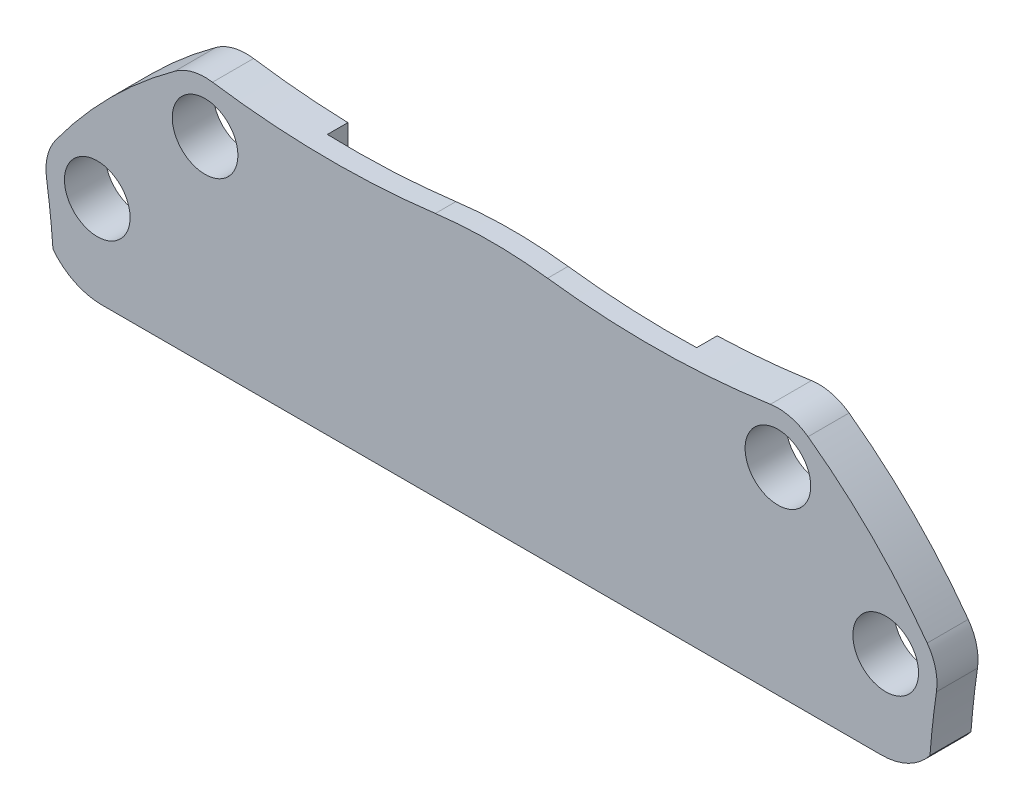
ISO-10303-21;
HEADER;
FILE_DESCRIPTION(('STEP AP214'),'2;1');
FILE_NAME('part.step','',(''),(''),'','','');
FILE_SCHEMA(('AUTOMOTIVE_DESIGN { 1 0 10303 214 1 1 1 1 }'));
ENDSEC;
DATA;
#1=APPLICATION_CONTEXT('core data for automotive mechanical design processes');
#2=APPLICATION_PROTOCOL_DEFINITION('international standard','automotive_design',2000,#1);
#3=PRODUCT_CONTEXT('',#1,'mechanical');
#4=PRODUCT('Part','Part','',(#3));
#5=PRODUCT_RELATED_PRODUCT_CATEGORY('part','',(#4));
#6=PRODUCT_DEFINITION_FORMATION('','',#4);
#7=PRODUCT_DEFINITION_CONTEXT('part definition',#1,'design');
#8=PRODUCT_DEFINITION('design','',#6,#7);
#9=PRODUCT_DEFINITION_SHAPE('','',#8);
#10=(LENGTH_UNIT() NAMED_UNIT(*) SI_UNIT(.MILLI.,.METRE.));
#11=(NAMED_UNIT(*) PLANE_ANGLE_UNIT() SI_UNIT($,.RADIAN.));
#12=(NAMED_UNIT(*) SI_UNIT($,.STERADIAN.) SOLID_ANGLE_UNIT());
#13=UNCERTAINTY_MEASURE_WITH_UNIT(LENGTH_MEASURE(1.E-05),#10,'distance_accuracy_value','');
#14=(GEOMETRIC_REPRESENTATION_CONTEXT(3) GLOBAL_UNCERTAINTY_ASSIGNED_CONTEXT((#13)) GLOBAL_UNIT_ASSIGNED_CONTEXT((#10,
#11,#12)) REPRESENTATION_CONTEXT('',''));
#15=CARTESIAN_POINT('',(0.,0.,0.));
#16=DIRECTION('',(0.,0.,1.));
#17=DIRECTION('',(1.,0.,0.));
#18=AXIS2_PLACEMENT_3D('',#15,#16,#17);
#19=CARTESIAN_POINT('',(0.,0.,2.));
#20=DIRECTION('',(0.,0.,1.));
#21=DIRECTION('',(1.,0.,0.));
#22=AXIS2_PLACEMENT_3D('',#19,#20,#21);
#23=PLANE('',#22);
#24=CARTESIAN_POINT('',(-19.2141536164048,13.9598997419465,2.));
#25=DIRECTION('',(0.,0.,1.));
#26=DIRECTION('',(1.,0.,0.));
#27=AXIS2_PLACEMENT_3D('',#24,#25,#26);
#28=CIRCLE('',#27,1.6);
#29=CARTESIAN_POINT('',(-17.6141536164048,13.9598997419465,2.));
#30=VERTEX_POINT('',#29);
#31=EDGE_CURVE('E111',#30,#30,#28,.F.);
#32=ORIENTED_EDGE('',*,*,#31,.T.);
#33=EDGE_LOOP('',(#32));
#34=FACE_BOUND('',#33,.T.);
#35=CARTESIAN_POINT('',(-13.9598997419461,19.2141536164051,2.));
#36=DIRECTION('',(0.,0.,1.));
#37=DIRECTION('',(1.,0.,0.));
#38=AXIS2_PLACEMENT_3D('',#35,#36,#37);
#39=CIRCLE('',#38,1.6);
#40=CARTESIAN_POINT('',(-12.3598997419461,19.2141536164051,2.));
#41=VERTEX_POINT('',#40);
#42=EDGE_CURVE('E223',#41,#41,#39,.F.);
#43=ORIENTED_EDGE('',*,*,#42,.T.);
#44=EDGE_LOOP('',(#43));
#45=FACE_BOUND('',#44,.T.);
#46=CARTESIAN_POINT('',(19.2141536164048,13.9598997419465,2.));
#47=DIRECTION('',(0.,0.,1.));
#48=DIRECTION('',(1.,0.,0.));
#49=AXIS2_PLACEMENT_3D('',#46,#47,#48);
#50=CIRCLE('',#49,1.6);
#51=CARTESIAN_POINT('',(20.8141536164048,13.9598997419465,2.));
#52=VERTEX_POINT('',#51);
#53=EDGE_CURVE('E219',#52,#52,#50,.T.);
#54=ORIENTED_EDGE('',*,*,#53,.F.);
#55=EDGE_LOOP('',(#54));
#56=FACE_BOUND('',#55,.T.);
#57=CARTESIAN_POINT('',(13.9598997419461,19.2141536164051,2.));
#58=DIRECTION('',(0.,0.,1.));
#59=DIRECTION('',(1.,0.,0.));
#60=AXIS2_PLACEMENT_3D('',#57,#58,#59);
#61=CIRCLE('',#60,1.6);
#62=CARTESIAN_POINT('',(15.5598997419461,19.2141536164051,2.));
#63=VERTEX_POINT('',#62);
#64=EDGE_CURVE('E141',#63,#63,#61,.T.);
#65=ORIENTED_EDGE('',*,*,#64,.F.);
#66=EDGE_LOOP('',(#65));
#67=FACE_BOUND('',#66,.T.);
#68=CARTESIAN_POINT('',(-61.2600208973505,7.763526238531,2.));
#69=DIRECTION('',(0.,0.,1.));
#70=DIRECTION('',(1.,0.,0.));
#71=AXIS2_PLACEMENT_3D('',#68,#69,#70);
#72=CIRCLE('',#71,40.0000000000088);
#73=CARTESIAN_POINT('',(-21.3716523307277,10.7498371891792,2.));
#74=VERTEX_POINT('',#73);
#75=CARTESIAN_POINT('',(-21.687439927048,13.5954071829217,2.));
#76=VERTEX_POINT('',#75);
#77=EDGE_CURVE('E357',#74,#76,#72,.T.);
#78=ORIENTED_EDGE('',*,*,#77,.F.);
#79=CARTESIAN_POINT('',(-19.,12.5870266791758,2.));
#80=DIRECTION('',(0.,0.,1.));
#81=DIRECTION('',(1.,0.,0.));
#82=AXIS2_PLACEMENT_3D('',#79,#80,#81);
#83=CIRCLE('',#82,3.);
#84=CARTESIAN_POINT('',(-19.,9.58702667917576,2.));
#85=VERTEX_POINT('',#84);
#86=EDGE_CURVE('E72',#74,#85,#83,.T.);
#87=ORIENTED_EDGE('',*,*,#86,.T.);
#88=DIRECTION('',(1.,0.,0.));
#89=VECTOR('',#88,1.);
#90=CARTESIAN_POINT('',(0.,9.58702667917577,2.));
#91=LINE('',#90,#89);
#92=CARTESIAN_POINT('',(19.,9.58702667917577,2.));
#93=VERTEX_POINT('',#92);
#94=EDGE_CURVE('E108',#85,#93,#91,.T.);
#95=ORIENTED_EDGE('',*,*,#94,.T.);
#96=CARTESIAN_POINT('',(19.,12.5870266791758,2.));
#97=DIRECTION('',(0.,0.,1.));
#98=DIRECTION('',(1.,0.,0.));
#99=AXIS2_PLACEMENT_3D('',#96,#97,#98);
#100=CIRCLE('',#99,3.);
#101=CARTESIAN_POINT('',(21.3716523307346,10.7498371891882,2.));
#102=VERTEX_POINT('',#101);
#103=EDGE_CURVE('E213',#93,#102,#100,.T.);
#104=ORIENTED_EDGE('',*,*,#103,.T.);
#105=CARTESIAN_POINT('',(61.2600208973574,7.76352623860516,2.));
#106=DIRECTION('',(0.,0.,1.));
#107=DIRECTION('',(1.,0.,0.));
#108=AXIS2_PLACEMENT_3D('',#105,#106,#107);
#109=CIRCLE('',#108,40.0000000000053);
#110=CARTESIAN_POINT('',(21.6874399270511,13.595407182947,2.));
#111=VERTEX_POINT('',#110);
#112=EDGE_CURVE('E348',#111,#102,#109,.T.);
#113=ORIENTED_EDGE('',*,*,#112,.F.);
#114=CARTESIAN_POINT('',(19.2141536164057,13.9598997419693,2.));
#115=DIRECTION('',(0.,0.,-1.));
#116=DIRECTION('',(1.,0.,0.));
#117=AXIS2_PLACEMENT_3D('',#114,#115,#116);
#118=CIRCLE('',#117,2.49999999999988);
#119=CARTESIAN_POINT('',(21.2366961023423,15.4293628727013,2.));
#120=VERTEX_POINT('',#119);
#121=EDGE_CURVE('E343',#120,#111,#118,.T.);
#122=ORIENTED_EDGE('',*,*,#121,.F.);
#123=CARTESIAN_POINT('',(8.54829072111014E-12,1.20749670708231E-11,2.));
#124=DIRECTION('',(0.,0.,-1.));
#125=DIRECTION('',(1.,0.,0.));
#126=AXIS2_PLACEMENT_3D('',#123,#124,#125);
#127=CIRCLE('',#126,26.2499999999994);
#128=CARTESIAN_POINT('',(15.4293628726751,21.236696102365,2.));
#129=VERTEX_POINT('',#128);
#130=EDGE_CURVE('E339',#129,#120,#127,.T.);
#131=ORIENTED_EDGE('',*,*,#130,.F.);
#132=CARTESIAN_POINT('',(13.95989974195,19.2141536164241,2.));
#133=DIRECTION('',(0.,0.,-1.));
#134=DIRECTION('',(1.,0.,0.));
#135=AXIS2_PLACEMENT_3D('',#132,#133,#134);
#136=CIRCLE('',#135,2.4999999999993);
#137=CARTESIAN_POINT('',(13.5954071829199,21.6874399270659,2.));
#138=VERTEX_POINT('',#137);
#139=EDGE_CURVE('E321',#138,#129,#136,.T.);
#140=ORIENTED_EDGE('',*,*,#139,.F.);
#141=CARTESIAN_POINT('',(7.76352623852903,61.2600208973597,2.));
#142=DIRECTION('',(0.,0.,1.));
#143=DIRECTION('',(1.,0.,0.));
#144=AXIS2_PLACEMENT_3D('',#141,#142,#143);
#145=CIRCLE('',#144,39.9999999999979);
#146=CARTESIAN_POINT('',(2.73452138766575,21.5774162674992,2.));
#147=VERTEX_POINT('',#146);
#148=EDGE_CURVE('E335',#147,#138,#145,.T.);
#149=ORIENTED_EDGE('',*,*,#148,.F.);
#150=CARTESIAN_POINT('',(8.54829072111014E-12,1.20749670708231E-11,2.));
#151=DIRECTION('',(0.,0.,-1.));
#152=DIRECTION('',(1.,0.,0.));
#153=AXIS2_PLACEMENT_3D('',#150,#151,#152);
#154=CIRCLE('',#153,21.7499999999988);
#155=CARTESIAN_POINT('',(-2.73452138767389,21.5774162674954,2.));
#156=VERTEX_POINT('',#155);
#157=EDGE_CURVE('E376',#156,#147,#154,.T.);
#158=ORIENTED_EDGE('',*,*,#157,.F.);
#159=CARTESIAN_POINT('',(-7.76352623858461,61.2600208973507,2.));
#160=DIRECTION('',(0.,0.,1.));
#161=DIRECTION('',(1.,0.,0.));
#162=AXIS2_PLACEMENT_3D('',#159,#160,#161);
#163=CIRCLE('',#162,39.9999999999993);
#164=CARTESIAN_POINT('',(-13.5954071829282,21.6874399270507,2.));
#165=VERTEX_POINT('',#164);
#166=EDGE_CURVE('E373',#165,#156,#163,.T.);
#167=ORIENTED_EDGE('',*,*,#166,.F.);
#168=CARTESIAN_POINT('',(-13.9598997419434,19.2141536164078,2.));
#169=DIRECTION('',(0.,0.,-1.));
#170=DIRECTION('',(1.,0.,0.));
#171=AXIS2_PLACEMENT_3D('',#168,#169,#170);
#172=CIRCLE('',#171,2.49999999999932);
#173=CARTESIAN_POINT('',(-15.4293628726804,21.2366961023401,2.));
#174=VERTEX_POINT('',#173);
#175=EDGE_CURVE('E369',#174,#165,#172,.T.);
#176=ORIENTED_EDGE('',*,*,#175,.F.);
#177=CARTESIAN_POINT('',(8.54829072111014E-12,1.20749670708231E-11,2.));
#178=DIRECTION('',(0.,0.,-1.));
#179=DIRECTION('',(1.,0.,0.));
#180=AXIS2_PLACEMENT_3D('',#177,#178,#179);
#181=CIRCLE('',#180,26.2499999999983);
#182=CARTESIAN_POINT('',(-21.2366961023416,15.429362872676,2.));
#183=VERTEX_POINT('',#182);
#184=EDGE_CURVE('E365',#183,#174,#181,.T.);
#185=ORIENTED_EDGE('',*,*,#184,.F.);
#186=CARTESIAN_POINT('',(-19.2141536164048,13.9598997419465,2.));
#187=DIRECTION('',(0.,0.,-1.));
#188=DIRECTION('',(1.,0.,0.));
#189=AXIS2_PLACEMENT_3D('',#186,#187,#188);
#190=CIRCLE('',#189,2.49999999999989);
#191=EDGE_CURVE('E361',#76,#183,#190,.T.);
#192=ORIENTED_EDGE('',*,*,#191,.F.);
#193=EDGE_LOOP('',(#78,#87,#95,#104,#113,#122,#131,#140,#149,#158,#167,#176,#185,#192));
#194=FACE_BOUND('',#193,.T.);
#195=ADVANCED_FACE('F47',(#34,#45,#56,#67,#194),#23,.T.);
#196=CARTESIAN_POINT('',(0.,0.,0.));
#197=DIRECTION('',(0.,0.,1.));
#198=DIRECTION('',(1.,0.,0.));
#199=AXIS2_PLACEMENT_3D('',#196,#197,#198);
#200=PLANE('',#199);
#201=CARTESIAN_POINT('',(13.9598997419461,19.2141536164051,0.));
#202=DIRECTION('',(0.,0.,1.));
#203=DIRECTION('',(1.,0.,0.));
#204=AXIS2_PLACEMENT_3D('',#201,#202,#203);
#205=CIRCLE('',#204,1.6);
#206=CARTESIAN_POINT('',(15.5598997419461,19.2141536164051,0.));
#207=VERTEX_POINT('',#206);
#208=EDGE_CURVE('E127',#207,#207,#205,.T.);
#209=ORIENTED_EDGE('',*,*,#208,.T.);
#210=EDGE_LOOP('',(#209));
#211=FACE_BOUND('',#210,.T.);
#212=CARTESIAN_POINT('',(19.2141536164048,13.9598997419465,0.));
#213=DIRECTION('',(0.,0.,1.));
#214=DIRECTION('',(1.,0.,0.));
#215=AXIS2_PLACEMENT_3D('',#212,#213,#214);
#216=CIRCLE('',#215,1.6);
#217=CARTESIAN_POINT('',(20.8141536164048,13.9598997419465,0.));
#218=VERTEX_POINT('',#217);
#219=EDGE_CURVE('E98',#218,#218,#216,.T.);
#220=ORIENTED_EDGE('',*,*,#219,.T.);
#221=EDGE_LOOP('',(#220));
#222=FACE_BOUND('',#221,.T.);
#223=DIRECTION('',(0.,-1.,0.));
#224=VECTOR('',#223,1.);
#225=CARTESIAN_POINT('',(9.,23.5870266791758,0.));
#226=LINE('',#225,#224);
#227=CARTESIAN_POINT('',(9.,21.2791363068829,0.));
#228=VERTEX_POINT('',#227);
#229=CARTESIAN_POINT('',(9.,9.58702667917577,0.));
#230=VERTEX_POINT('',#229);
#231=EDGE_CURVE('E202',#228,#230,#226,.T.);
#232=ORIENTED_EDGE('',*,*,#231,.F.);
#233=CARTESIAN_POINT('',(7.76352623852903,61.2600208973597,0.));
#234=DIRECTION('',(0.,0.,1.));
#235=DIRECTION('',(1.,0.,0.));
#236=AXIS2_PLACEMENT_3D('',#233,#234,#235);
#237=CIRCLE('',#236,39.9999999999979);
#238=CARTESIAN_POINT('',(13.5954071829199,21.6874399270659,0.));
#239=VERTEX_POINT('',#238);
#240=EDGE_CURVE('E63',#228,#239,#237,.T.);
#241=ORIENTED_EDGE('',*,*,#240,.T.);
#242=CARTESIAN_POINT('',(13.95989974195,19.2141536164241,0.));
#243=DIRECTION('',(0.,0.,-1.));
#244=DIRECTION('',(1.,0.,0.));
#245=AXIS2_PLACEMENT_3D('',#242,#243,#244);
#246=CIRCLE('',#245,2.4999999999993);
#247=CARTESIAN_POINT('',(15.4293628726751,21.236696102365,0.));
#248=VERTEX_POINT('',#247);
#249=EDGE_CURVE('E351',#239,#248,#246,.T.);
#250=ORIENTED_EDGE('',*,*,#249,.T.);
#251=CARTESIAN_POINT('',(8.54829072111014E-12,1.20749670708231E-11,0.));
#252=DIRECTION('',(0.,0.,-1.));
#253=DIRECTION('',(1.,0.,0.));
#254=AXIS2_PLACEMENT_3D('',#251,#252,#253);
#255=CIRCLE('',#254,26.2499999999994);
#256=CARTESIAN_POINT('',(21.2366961023423,15.4293628727013,0.));
#257=VERTEX_POINT('',#256);
#258=EDGE_CURVE('E334',#248,#257,#255,.T.);
#259=ORIENTED_EDGE('',*,*,#258,.T.);
#260=CARTESIAN_POINT('',(19.2141536164057,13.9598997419693,0.));
#261=DIRECTION('',(0.,0.,-1.));
#262=DIRECTION('',(1.,0.,0.));
#263=AXIS2_PLACEMENT_3D('',#260,#261,#262);
#264=CIRCLE('',#263,2.49999999999988);
#265=CARTESIAN_POINT('',(21.6874399270511,13.595407182947,0.));
#266=VERTEX_POINT('',#265);
#267=EDGE_CURVE('E450',#257,#266,#264,.T.);
#268=ORIENTED_EDGE('',*,*,#267,.T.);
#269=CARTESIAN_POINT('',(61.2600208973574,7.76352623860516,0.));
#270=DIRECTION('',(0.,0.,1.));
#271=DIRECTION('',(1.,0.,0.));
#272=AXIS2_PLACEMENT_3D('',#269,#270,#271);
#273=CIRCLE('',#272,40.0000000000053);
#274=CARTESIAN_POINT('',(21.3716523307346,10.7498371891882,0.));
#275=VERTEX_POINT('',#274);
#276=EDGE_CURVE('E446',#266,#275,#273,.T.);
#277=ORIENTED_EDGE('',*,*,#276,.T.);
#278=CARTESIAN_POINT('',(19.,12.5870266791758,0.));
#279=DIRECTION('',(0.,0.,1.));
#280=DIRECTION('',(1.,0.,0.));
#281=AXIS2_PLACEMENT_3D('',#278,#279,#280);
#282=CIRCLE('',#281,3.);
#283=CARTESIAN_POINT('',(19.,9.58702667917577,0.));
#284=VERTEX_POINT('',#283);
#285=EDGE_CURVE('E99',#284,#275,#282,.T.);
#286=ORIENTED_EDGE('',*,*,#285,.F.);
#287=DIRECTION('',(1.,0.,0.));
#288=VECTOR('',#287,1.);
#289=CARTESIAN_POINT('',(0.,9.58702667917577,0.));
#290=LINE('',#289,#288);
#291=EDGE_CURVE('E121',#230,#284,#290,.T.);
#292=ORIENTED_EDGE('',*,*,#291,.F.);
#293=EDGE_LOOP('',(#232,#241,#250,#259,#268,#277,#286,#292));
#294=FACE_BOUND('',#293,.T.);
#295=ADVANCED_FACE('F240',(#211,#222,#294),#200,.F.);
#296=CARTESIAN_POINT('',(-19.2141536164048,13.9598997419465,0.));
#297=DIRECTION('',(0.,0.,1.));
#298=DIRECTION('',(1.,0.,0.));
#299=AXIS2_PLACEMENT_3D('',#296,#297,#298);
#300=CIRCLE('',#299,1.6);
#301=CARTESIAN_POINT('',(-17.6141536164048,13.9598997419465,0.));
#302=VERTEX_POINT('',#301);
#303=EDGE_CURVE('E138',#302,#302,#300,.F.);
#304=ORIENTED_EDGE('',*,*,#303,.F.);
#305=EDGE_LOOP('',(#304));
#306=FACE_BOUND('',#305,.T.);
#307=CARTESIAN_POINT('',(-13.9598997419461,19.2141536164051,0.));
#308=DIRECTION('',(0.,0.,1.));
#309=DIRECTION('',(1.,0.,0.));
#310=AXIS2_PLACEMENT_3D('',#307,#308,#309);
#311=CIRCLE('',#310,1.6);
#312=CARTESIAN_POINT('',(-12.3598997419461,19.2141536164051,0.));
#313=VERTEX_POINT('',#312);
#314=EDGE_CURVE('E134',#313,#313,#311,.F.);
#315=ORIENTED_EDGE('',*,*,#314,.F.);
#316=EDGE_LOOP('',(#315));
#317=FACE_BOUND('',#316,.T.);
#318=CARTESIAN_POINT('',(-13.9598997419434,19.2141536164078,0.));
#319=DIRECTION('',(0.,0.,-1.));
#320=DIRECTION('',(1.,0.,0.));
#321=AXIS2_PLACEMENT_3D('',#318,#319,#320);
#322=CIRCLE('',#321,2.49999999999932);
#323=CARTESIAN_POINT('',(-15.4293628726804,21.2366961023401,0.));
#324=VERTEX_POINT('',#323);
#325=CARTESIAN_POINT('',(-13.5954071829282,21.6874399270507,0.));
#326=VERTEX_POINT('',#325);
#327=EDGE_CURVE('E430',#324,#326,#322,.T.);
#328=ORIENTED_EDGE('',*,*,#327,.T.);
#329=CARTESIAN_POINT('',(-7.76352623858461,61.2600208973507,0.));
#330=DIRECTION('',(0.,0.,1.));
#331=DIRECTION('',(1.,0.,0.));
#332=AXIS2_PLACEMENT_3D('',#329,#330,#331);
#333=CIRCLE('',#332,39.9999999999993);
#334=CARTESIAN_POINT('',(-9.,21.2791363068707,0.));
#335=VERTEX_POINT('',#334);
#336=EDGE_CURVE('E426',#326,#335,#333,.T.);
#337=ORIENTED_EDGE('',*,*,#336,.T.);
#338=DIRECTION('',(0.,-1.,0.));
#339=VECTOR('',#338,1.);
#340=CARTESIAN_POINT('',(-9.,23.5870266791758,0.));
#341=LINE('',#340,#339);
#342=CARTESIAN_POINT('',(-9.,9.58702667917576,0.));
#343=VERTEX_POINT('',#342);
#344=EDGE_CURVE('E118',#335,#343,#341,.T.);
#345=ORIENTED_EDGE('',*,*,#344,.T.);
#346=CARTESIAN_POINT('',(-19.,9.58702667917576,0.));
#347=VERTEX_POINT('',#346);
#348=EDGE_CURVE('E106',#347,#343,#290,.T.);
#349=ORIENTED_EDGE('',*,*,#348,.F.);
#350=CARTESIAN_POINT('',(-19.,12.5870266791758,0.));
#351=DIRECTION('',(0.,0.,1.));
#352=DIRECTION('',(1.,0.,0.));
#353=AXIS2_PLACEMENT_3D('',#350,#351,#352);
#354=CIRCLE('',#353,3.);
#355=CARTESIAN_POINT('',(-21.3716523307277,10.7498371891792,0.));
#356=VERTEX_POINT('',#355);
#357=EDGE_CURVE('E86',#356,#347,#354,.T.);
#358=ORIENTED_EDGE('',*,*,#357,.F.);
#359=CARTESIAN_POINT('',(-61.2600208973505,7.763526238531,0.));
#360=DIRECTION('',(0.,0.,1.));
#361=DIRECTION('',(1.,0.,0.));
#362=AXIS2_PLACEMENT_3D('',#359,#360,#361);
#363=CIRCLE('',#362,40.0000000000088);
#364=CARTESIAN_POINT('',(-21.687439927048,13.5954071829217,0.));
#365=VERTEX_POINT('',#364);
#366=EDGE_CURVE('E443',#356,#365,#363,.T.);
#367=ORIENTED_EDGE('',*,*,#366,.T.);
#368=CARTESIAN_POINT('',(-19.2141536164048,13.9598997419465,0.));
#369=DIRECTION('',(0.,0.,-1.));
#370=DIRECTION('',(1.,0.,0.));
#371=AXIS2_PLACEMENT_3D('',#368,#369,#370);
#372=CIRCLE('',#371,2.49999999999989);
#373=CARTESIAN_POINT('',(-21.2366961023416,15.429362872676,0.));
#374=VERTEX_POINT('',#373);
#375=EDGE_CURVE('E439',#365,#374,#372,.T.);
#376=ORIENTED_EDGE('',*,*,#375,.T.);
#377=CARTESIAN_POINT('',(8.54829072111014E-12,1.20749670708231E-11,0.));
#378=DIRECTION('',(0.,0.,-1.));
#379=DIRECTION('',(1.,0.,0.));
#380=AXIS2_PLACEMENT_3D('',#377,#378,#379);
#381=CIRCLE('',#380,26.2499999999983);
#382=EDGE_CURVE('E435',#374,#324,#381,.T.);
#383=ORIENTED_EDGE('',*,*,#382,.T.);
#384=EDGE_LOOP('',(#328,#337,#345,#349,#358,#367,#376,#383));
#385=FACE_BOUND('',#384,.T.);
#386=ADVANCED_FACE('F115',(#306,#317,#385),#200,.F.);
#387=CARTESIAN_POINT('',(0.,9.58702667917577,2.));
#388=DIRECTION('',(0.,1.,0.));
#389=DIRECTION('',(-1.,0.,0.));
#390=AXIS2_PLACEMENT_3D('',#387,#388,#389);
#391=PLANE('',#390);
#392=ORIENTED_EDGE('',*,*,#348,.T.);
#393=DIRECTION('',(0.,0.,-1.));
#394=VECTOR('',#393,1.);
#395=CARTESIAN_POINT('',(-9.,9.58702667917576,0.));
#396=LINE('',#395,#394);
#397=CARTESIAN_POINT('',(-9.,9.58702667917576,1.));
#398=VERTEX_POINT('',#397);
#399=EDGE_CURVE('E179',#398,#343,#396,.T.);
#400=ORIENTED_EDGE('',*,*,#399,.F.);
#401=DIRECTION('',(-1.,0.,0.));
#402=VECTOR('',#401,1.);
#403=CARTESIAN_POINT('',(-9.,9.58702667917576,1.));
#404=LINE('',#403,#402);
#405=CARTESIAN_POINT('',(9.,9.58702667917577,1.));
#406=VERTEX_POINT('',#405);
#407=EDGE_CURVE('E193',#406,#398,#404,.T.);
#408=ORIENTED_EDGE('',*,*,#407,.F.);
#409=DIRECTION('',(0.,0.,1.));
#410=VECTOR('',#409,1.);
#411=CARTESIAN_POINT('',(9.,9.58702667917577,0.));
#412=LINE('',#411,#410);
#413=EDGE_CURVE('E184',#230,#406,#412,.T.);
#414=ORIENTED_EDGE('',*,*,#413,.F.);
#415=ORIENTED_EDGE('',*,*,#291,.T.);
#416=DIRECTION('',(0.,0.,-1.));
#417=VECTOR('',#416,1.);
#418=CARTESIAN_POINT('',(19.,9.58702667917577,2.));
#419=LINE('',#418,#417);
#420=EDGE_CURVE('E110',#93,#284,#419,.T.);
#421=ORIENTED_EDGE('',*,*,#420,.F.);
#422=ORIENTED_EDGE('',*,*,#94,.F.);
#423=DIRECTION('',(0.,0.,-1.));
#424=VECTOR('',#423,1.);
#425=CARTESIAN_POINT('',(-19.,9.58702667917576,2.));
#426=LINE('',#425,#424);
#427=EDGE_CURVE('E89',#85,#347,#426,.T.);
#428=ORIENTED_EDGE('',*,*,#427,.T.);
#429=EDGE_LOOP('',(#392,#400,#408,#414,#415,#421,#422,#428));
#430=FACE_BOUND('',#429,.T.);
#431=ADVANCED_FACE('F103',(#430),#391,.F.);
#432=CARTESIAN_POINT('',(19.,12.5870266791758,2.));
#433=DIRECTION('',(0.,0.,-1.));
#434=DIRECTION('',(-1.,0.,0.));
#435=AXIS2_PLACEMENT_3D('',#432,#433,#434);
#436=CYLINDRICAL_SURFACE('',#435,3.);
#437=ORIENTED_EDGE('',*,*,#285,.T.);
#438=DIRECTION('',(0.,0.,1.));
#439=VECTOR('',#438,1.);
#440=CARTESIAN_POINT('',(21.3716523307346,10.7498371891882,0.));
#441=LINE('',#440,#439);
#442=EDGE_CURVE('E410',#275,#102,#441,.T.);
#443=ORIENTED_EDGE('',*,*,#442,.T.);
#444=ORIENTED_EDGE('',*,*,#103,.F.);
#445=ORIENTED_EDGE('',*,*,#420,.T.);
#446=EDGE_LOOP('',(#437,#443,#444,#445));
#447=FACE_BOUND('',#446,.T.);
#448=ADVANCED_FACE('F247',(#447),#436,.T.);
#449=CARTESIAN_POINT('',(-13.9598997419461,19.2141536164051,2.));
#450=DIRECTION('',(0.,0.,-1.));
#451=DIRECTION('',(-1.,0.,0.));
#452=AXIS2_PLACEMENT_3D('',#449,#450,#451);
#453=CYLINDRICAL_SURFACE('',#452,1.6);
#454=ORIENTED_EDGE('',*,*,#42,.F.);
#455=EDGE_LOOP('',(#454));
#456=FACE_BOUND('',#455,.T.);
#457=ORIENTED_EDGE('',*,*,#314,.T.);
#458=EDGE_LOOP('',(#457));
#459=FACE_BOUND('',#458,.T.);
#460=ADVANCED_FACE('F244',(#456,#459),#453,.F.);
#461=CARTESIAN_POINT('',(19.2141536164048,13.9598997419465,2.));
#462=DIRECTION('',(0.,0.,-1.));
#463=DIRECTION('',(-1.,0.,0.));
#464=AXIS2_PLACEMENT_3D('',#461,#462,#463);
#465=CYLINDRICAL_SURFACE('',#464,1.6);
#466=ORIENTED_EDGE('',*,*,#53,.T.);
#467=EDGE_LOOP('',(#466));
#468=FACE_BOUND('',#467,.T.);
#469=ORIENTED_EDGE('',*,*,#219,.F.);
#470=EDGE_LOOP('',(#469));
#471=FACE_BOUND('',#470,.T.);
#472=ADVANCED_FACE('F246',(#468,#471),#465,.F.);
#473=CARTESIAN_POINT('',(-19.,12.5870266791758,2.));
#474=DIRECTION('',(0.,0.,-1.));
#475=DIRECTION('',(-1.,0.,0.));
#476=AXIS2_PLACEMENT_3D('',#473,#474,#475);
#477=CYLINDRICAL_SURFACE('',#476,3.);
#478=ORIENTED_EDGE('',*,*,#86,.F.);
#479=DIRECTION('',(0.,0.,1.));
#480=VECTOR('',#479,1.);
#481=CARTESIAN_POINT('',(-21.3716523307277,10.7498371891792,0.));
#482=LINE('',#481,#480);
#483=EDGE_CURVE('E93',#356,#74,#482,.T.);
#484=ORIENTED_EDGE('',*,*,#483,.F.);
#485=ORIENTED_EDGE('',*,*,#357,.T.);
#486=ORIENTED_EDGE('',*,*,#427,.F.);
#487=EDGE_LOOP('',(#478,#484,#485,#486));
#488=FACE_BOUND('',#487,.T.);
#489=ADVANCED_FACE('F88',(#488),#477,.T.);
#490=CARTESIAN_POINT('',(13.9598997419461,19.2141536164051,2.));
#491=DIRECTION('',(0.,0.,-1.));
#492=DIRECTION('',(-1.,0.,0.));
#493=AXIS2_PLACEMENT_3D('',#490,#491,#492);
#494=CYLINDRICAL_SURFACE('',#493,1.6);
#495=ORIENTED_EDGE('',*,*,#64,.T.);
#496=EDGE_LOOP('',(#495));
#497=FACE_BOUND('',#496,.T.);
#498=ORIENTED_EDGE('',*,*,#208,.F.);
#499=EDGE_LOOP('',(#498));
#500=FACE_BOUND('',#499,.T.);
#501=ADVANCED_FACE('F49',(#497,#500),#494,.F.);
#502=CARTESIAN_POINT('',(-19.2141536164048,13.9598997419465,2.));
#503=DIRECTION('',(0.,0.,-1.));
#504=DIRECTION('',(-1.,0.,0.));
#505=AXIS2_PLACEMENT_3D('',#502,#503,#504);
#506=CYLINDRICAL_SURFACE('',#505,1.6);
#507=ORIENTED_EDGE('',*,*,#31,.F.);
#508=EDGE_LOOP('',(#507));
#509=FACE_BOUND('',#508,.T.);
#510=ORIENTED_EDGE('',*,*,#303,.T.);
#511=EDGE_LOOP('',(#510));
#512=FACE_BOUND('',#511,.T.);
#513=ADVANCED_FACE('F232',(#509,#512),#506,.F.);
#514=CARTESIAN_POINT('',(-9.,23.5870266791758,0.));
#515=DIRECTION('',(-1.,0.,0.));
#516=DIRECTION('',(0.,-1.,0.));
#517=AXIS2_PLACEMENT_3D('',#514,#515,#516);
#518=PLANE('',#517);
#519=ORIENTED_EDGE('',*,*,#344,.F.);
#520=DIRECTION('',(0.,0.,1.));
#521=VECTOR('',#520,1.);
#522=CARTESIAN_POINT('',(-9.,21.2791363068707,0.));
#523=LINE('',#522,#521);
#524=CARTESIAN_POINT('',(-9.,21.2791363068707,1.));
#525=VERTEX_POINT('',#524);
#526=EDGE_CURVE('E171',#335,#525,#523,.T.);
#527=ORIENTED_EDGE('',*,*,#526,.T.);
#528=DIRECTION('',(0.,-1.,0.));
#529=VECTOR('',#528,1.);
#530=CARTESIAN_POINT('',(-9.,23.5870266791758,1.));
#531=LINE('',#530,#529);
#532=EDGE_CURVE('E161',#525,#398,#531,.T.);
#533=ORIENTED_EDGE('',*,*,#532,.T.);
#534=ORIENTED_EDGE('',*,*,#399,.T.);
#535=EDGE_LOOP('',(#519,#527,#533,#534));
#536=FACE_BOUND('',#535,.T.);
#537=ADVANCED_FACE('F177',(#536),#518,.F.);
#538=CARTESIAN_POINT('',(-9.,23.5870266791758,1.));
#539=DIRECTION('',(0.,0.,1.));
#540=DIRECTION('',(1.,0.,0.));
#541=AXIS2_PLACEMENT_3D('',#538,#539,#540);
#542=PLANE('',#541);
#543=CARTESIAN_POINT('',(8.54829072111014E-12,1.20749670708231E-11,1.));
#544=DIRECTION('',(0.,0.,1.));
#545=DIRECTION('',(1.,0.,0.));
#546=AXIS2_PLACEMENT_3D('',#543,#544,#545);
#547=CIRCLE('',#546,21.7499999999988);
#548=CARTESIAN_POINT('',(-2.73452138767389,21.5774162674954,1.00000000000001));
#549=VERTEX_POINT('',#548);
#550=CARTESIAN_POINT('',(2.73452138766575,21.5774162674992,1.));
#551=VERTEX_POINT('',#550);
#552=EDGE_CURVE('E11',#549,#551,#547,.F.);
#553=ORIENTED_EDGE('',*,*,#552,.T.);
#554=CARTESIAN_POINT('',(7.76352623852903,61.2600208973597,1.));
#555=DIRECTION('',(0.,0.,1.));
#556=DIRECTION('',(1.,0.,0.));
#557=AXIS2_PLACEMENT_3D('',#554,#555,#556);
#558=CIRCLE('',#557,39.9999999999979);
#559=CARTESIAN_POINT('',(9.,21.2791363068829,1.));
#560=VERTEX_POINT('',#559);
#561=EDGE_CURVE('E180',#551,#560,#558,.T.);
#562=ORIENTED_EDGE('',*,*,#561,.T.);
#563=DIRECTION('',(0.,-1.,0.));
#564=VECTOR('',#563,1.);
#565=CARTESIAN_POINT('',(9.,23.5870266791758,1.));
#566=LINE('',#565,#564);
#567=EDGE_CURVE('E198',#560,#406,#566,.T.);
#568=ORIENTED_EDGE('',*,*,#567,.T.);
#569=ORIENTED_EDGE('',*,*,#407,.T.);
#570=ORIENTED_EDGE('',*,*,#532,.F.);
#571=CARTESIAN_POINT('',(-7.76352623858461,61.2600208973507,1.));
#572=DIRECTION('',(0.,0.,1.));
#573=DIRECTION('',(1.,0.,0.));
#574=AXIS2_PLACEMENT_3D('',#571,#572,#573);
#575=CIRCLE('',#574,39.9999999999993);
#576=EDGE_CURVE('E56',#525,#549,#575,.T.);
#577=ORIENTED_EDGE('',*,*,#576,.T.);
#578=EDGE_LOOP('',(#553,#562,#568,#569,#570,#577));
#579=FACE_BOUND('',#578,.T.);
#580=ADVANCED_FACE('F154',(#579),#542,.F.);
#581=CARTESIAN_POINT('',(9.,23.5870266791758,0.));
#582=DIRECTION('',(1.,0.,0.));
#583=DIRECTION('',(0.,1.,0.));
#584=AXIS2_PLACEMENT_3D('',#581,#582,#583);
#585=PLANE('',#584);
#586=ORIENTED_EDGE('',*,*,#567,.F.);
#587=DIRECTION('',(0.,0.,1.));
#588=VECTOR('',#587,1.);
#589=CARTESIAN_POINT('',(9.,21.2791363068829,0.));
#590=LINE('',#589,#588);
#591=EDGE_CURVE('E146',#560,#228,#590,.F.);
#592=ORIENTED_EDGE('',*,*,#591,.T.);
#593=ORIENTED_EDGE('',*,*,#231,.T.);
#594=ORIENTED_EDGE('',*,*,#413,.T.);
#595=EDGE_LOOP('',(#586,#592,#593,#594));
#596=FACE_BOUND('',#595,.T.);
#597=ADVANCED_FACE('F268',(#596),#585,.F.);
#598=CARTESIAN_POINT('',(8.54829072111014E-12,1.20749670708231E-11,0.));
#599=DIRECTION('',(0.,0.,1.));
#600=DIRECTION('',(1.,0.,0.));
#601=AXIS2_PLACEMENT_3D('',#598,#599,#600);
#602=CYLINDRICAL_SURFACE('',#601,21.7499999999988);
#603=DIRECTION('',(0.,0.,1.));
#604=VECTOR('',#603,1.);
#605=CARTESIAN_POINT('',(-2.73452138767389,21.5774162674954,0.));
#606=LINE('',#605,#604);
#607=EDGE_CURVE('E174',#549,#156,#606,.T.);
#608=ORIENTED_EDGE('',*,*,#607,.T.);
#609=ORIENTED_EDGE('',*,*,#157,.T.);
#610=DIRECTION('',(0.,0.,1.));
#611=VECTOR('',#610,1.);
#612=CARTESIAN_POINT('',(2.73452138766575,21.5774162674992,0.));
#613=LINE('',#612,#611);
#614=EDGE_CURVE('E386',#551,#147,#613,.T.);
#615=ORIENTED_EDGE('',*,*,#614,.F.);
#616=ORIENTED_EDGE('',*,*,#552,.F.);
#617=EDGE_LOOP('',(#608,#609,#615,#616));
#618=FACE_BOUND('',#617,.T.);
#619=ADVANCED_FACE('F271',(#618),#602,.T.);
#620=CARTESIAN_POINT('',(-7.76352623858461,61.2600208973507,0.));
#621=DIRECTION('',(0.,0.,1.));
#622=DIRECTION('',(1.,0.,0.));
#623=AXIS2_PLACEMENT_3D('',#620,#621,#622);
#624=CYLINDRICAL_SURFACE('',#623,39.9999999999993);
#625=ORIENTED_EDGE('',*,*,#336,.F.);
#626=DIRECTION('',(0.,0.,1.));
#627=VECTOR('',#626,1.);
#628=CARTESIAN_POINT('',(-13.5954071829282,21.6874399270507,0.));
#629=LINE('',#628,#627);
#630=EDGE_CURVE('E392',#326,#165,#629,.T.);
#631=ORIENTED_EDGE('',*,*,#630,.T.);
#632=ORIENTED_EDGE('',*,*,#166,.T.);
#633=ORIENTED_EDGE('',*,*,#607,.F.);
#634=ORIENTED_EDGE('',*,*,#576,.F.);
#635=ORIENTED_EDGE('',*,*,#526,.F.);
#636=EDGE_LOOP('',(#625,#631,#632,#633,#634,#635));
#637=FACE_BOUND('',#636,.T.);
#638=ADVANCED_FACE('F169',(#637),#624,.F.);
#639=CARTESIAN_POINT('',(7.76352623852903,61.2600208973597,0.));
#640=DIRECTION('',(0.,0.,1.));
#641=DIRECTION('',(1.,0.,0.));
#642=AXIS2_PLACEMENT_3D('',#639,#640,#641);
#643=CYLINDRICAL_SURFACE('',#642,39.9999999999979);
#644=ORIENTED_EDGE('',*,*,#614,.T.);
#645=ORIENTED_EDGE('',*,*,#148,.T.);
#646=DIRECTION('',(0.,0.,1.));
#647=VECTOR('',#646,1.);
#648=CARTESIAN_POINT('',(13.5954071829199,21.6874399270659,0.));
#649=LINE('',#648,#647);
#650=EDGE_CURVE('E328',#239,#138,#649,.T.);
#651=ORIENTED_EDGE('',*,*,#650,.F.);
#652=ORIENTED_EDGE('',*,*,#240,.F.);
#653=ORIENTED_EDGE('',*,*,#591,.F.);
#654=ORIENTED_EDGE('',*,*,#561,.F.);
#655=EDGE_LOOP('',(#644,#645,#651,#652,#653,#654));
#656=FACE_BOUND('',#655,.T.);
#657=ADVANCED_FACE('F279',(#656),#643,.F.);
#658=CARTESIAN_POINT('',(8.54829072111014E-12,1.20749670708231E-11,0.));
#659=DIRECTION('',(0.,0.,1.));
#660=DIRECTION('',(1.,0.,0.));
#661=AXIS2_PLACEMENT_3D('',#658,#659,#660);
#662=CYLINDRICAL_SURFACE('',#661,26.2499999999994);
#663=ORIENTED_EDGE('',*,*,#130,.T.);
#664=DIRECTION('',(0.,0.,1.));
#665=VECTOR('',#664,1.);
#666=CARTESIAN_POINT('',(21.2366961023423,15.4293628727013,0.));
#667=LINE('',#666,#665);
#668=EDGE_CURVE('E417',#257,#120,#667,.T.);
#669=ORIENTED_EDGE('',*,*,#668,.F.);
#670=ORIENTED_EDGE('',*,*,#258,.F.);
#671=DIRECTION('',(0.,0.,1.));
#672=VECTOR('',#671,1.);
#673=CARTESIAN_POINT('',(15.4293628726751,21.236696102365,0.));
#674=LINE('',#673,#672);
#675=EDGE_CURVE('E186',#248,#129,#674,.T.);
#676=ORIENTED_EDGE('',*,*,#675,.T.);
#677=EDGE_LOOP('',(#663,#669,#670,#676));
#678=FACE_BOUND('',#677,.T.);
#679=ADVANCED_FACE('F275',(#678),#662,.T.);
#680=CARTESIAN_POINT('',(13.95989974195,19.2141536164241,0.));
#681=DIRECTION('',(0.,0.,1.));
#682=DIRECTION('',(1.,0.,0.));
#683=AXIS2_PLACEMENT_3D('',#680,#681,#682);
#684=CYLINDRICAL_SURFACE('',#683,2.4999999999993);
#685=ORIENTED_EDGE('',*,*,#139,.T.);
#686=ORIENTED_EDGE('',*,*,#675,.F.);
#687=ORIENTED_EDGE('',*,*,#249,.F.);
#688=ORIENTED_EDGE('',*,*,#650,.T.);
#689=EDGE_LOOP('',(#685,#686,#687,#688));
#690=FACE_BOUND('',#689,.T.);
#691=ADVANCED_FACE('F278',(#690),#684,.T.);
#692=CARTESIAN_POINT('',(-13.9598997419434,19.2141536164078,0.));
#693=DIRECTION('',(0.,0.,1.));
#694=DIRECTION('',(1.,0.,0.));
#695=AXIS2_PLACEMENT_3D('',#692,#693,#694);
#696=CYLINDRICAL_SURFACE('',#695,2.49999999999932);
#697=ORIENTED_EDGE('',*,*,#175,.T.);
#698=ORIENTED_EDGE('',*,*,#630,.F.);
#699=ORIENTED_EDGE('',*,*,#327,.F.);
#700=DIRECTION('',(0.,0.,1.));
#701=VECTOR('',#700,1.);
#702=CARTESIAN_POINT('',(-15.4293628726804,21.2366961023401,0.));
#703=LINE('',#702,#701);
#704=EDGE_CURVE('E396',#324,#174,#703,.T.);
#705=ORIENTED_EDGE('',*,*,#704,.T.);
#706=EDGE_LOOP('',(#697,#698,#699,#705));
#707=FACE_BOUND('',#706,.T.);
#708=ADVANCED_FACE('F300',(#707),#696,.T.);
#709=CARTESIAN_POINT('',(8.54829072111014E-12,1.20749670708231E-11,0.));
#710=DIRECTION('',(0.,0.,1.));
#711=DIRECTION('',(1.,0.,0.));
#712=AXIS2_PLACEMENT_3D('',#709,#710,#711);
#713=CYLINDRICAL_SURFACE('',#712,26.2499999999983);
#714=ORIENTED_EDGE('',*,*,#184,.T.);
#715=ORIENTED_EDGE('',*,*,#704,.F.);
#716=ORIENTED_EDGE('',*,*,#382,.F.);
#717=DIRECTION('',(0.,0.,1.));
#718=VECTOR('',#717,1.);
#719=CARTESIAN_POINT('',(-21.2366961023416,15.429362872676,0.));
#720=LINE('',#719,#718);
#721=EDGE_CURVE('E400',#374,#183,#720,.T.);
#722=ORIENTED_EDGE('',*,*,#721,.T.);
#723=EDGE_LOOP('',(#714,#715,#716,#722));
#724=FACE_BOUND('',#723,.T.);
#725=ADVANCED_FACE('F296',(#724),#713,.T.);
#726=CARTESIAN_POINT('',(-19.2141536164048,13.9598997419465,0.));
#727=DIRECTION('',(0.,0.,1.));
#728=DIRECTION('',(1.,0.,0.));
#729=AXIS2_PLACEMENT_3D('',#726,#727,#728);
#730=CYLINDRICAL_SURFACE('',#729,2.49999999999989);
#731=ORIENTED_EDGE('',*,*,#191,.T.);
#732=ORIENTED_EDGE('',*,*,#721,.F.);
#733=ORIENTED_EDGE('',*,*,#375,.F.);
#734=DIRECTION('',(0.,0.,1.));
#735=VECTOR('',#734,1.);
#736=CARTESIAN_POINT('',(-21.687439927048,13.5954071829217,0.));
#737=LINE('',#736,#735);
#738=EDGE_CURVE('E404',#365,#76,#737,.T.);
#739=ORIENTED_EDGE('',*,*,#738,.T.);
#740=EDGE_LOOP('',(#731,#732,#733,#739));
#741=FACE_BOUND('',#740,.T.);
#742=ADVANCED_FACE('F292',(#741),#730,.T.);
#743=CARTESIAN_POINT('',(-61.2600208973505,7.763526238531,0.));
#744=DIRECTION('',(0.,0.,1.));
#745=DIRECTION('',(1.,0.,0.));
#746=AXIS2_PLACEMENT_3D('',#743,#744,#745);
#747=CYLINDRICAL_SURFACE('',#746,40.0000000000088);
#748=ORIENTED_EDGE('',*,*,#77,.T.);
#749=ORIENTED_EDGE('',*,*,#738,.F.);
#750=ORIENTED_EDGE('',*,*,#366,.F.);
#751=ORIENTED_EDGE('',*,*,#483,.T.);
#752=EDGE_LOOP('',(#748,#749,#750,#751));
#753=FACE_BOUND('',#752,.T.);
#754=ADVANCED_FACE('F288',(#753),#747,.F.);
#755=CARTESIAN_POINT('',(61.2600208973574,7.76352623860516,0.));
#756=DIRECTION('',(0.,0.,1.));
#757=DIRECTION('',(1.,0.,0.));
#758=AXIS2_PLACEMENT_3D('',#755,#756,#757);
#759=CYLINDRICAL_SURFACE('',#758,40.0000000000053);
#760=ORIENTED_EDGE('',*,*,#112,.T.);
#761=ORIENTED_EDGE('',*,*,#442,.F.);
#762=ORIENTED_EDGE('',*,*,#276,.F.);
#763=DIRECTION('',(0.,0.,1.));
#764=VECTOR('',#763,1.);
#765=CARTESIAN_POINT('',(21.6874399270511,13.595407182947,0.));
#766=LINE('',#765,#764);
#767=EDGE_CURVE('E414',#266,#111,#766,.T.);
#768=ORIENTED_EDGE('',*,*,#767,.T.);
#769=EDGE_LOOP('',(#760,#761,#762,#768));
#770=FACE_BOUND('',#769,.T.);
#771=ADVANCED_FACE('F284',(#770),#759,.F.);
#772=CARTESIAN_POINT('',(19.2141536164057,13.9598997419693,0.));
#773=DIRECTION('',(0.,0.,1.));
#774=DIRECTION('',(1.,0.,0.));
#775=AXIS2_PLACEMENT_3D('',#772,#773,#774);
#776=CYLINDRICAL_SURFACE('',#775,2.49999999999988);
#777=ORIENTED_EDGE('',*,*,#121,.T.);
#778=ORIENTED_EDGE('',*,*,#767,.F.);
#779=ORIENTED_EDGE('',*,*,#267,.F.);
#780=ORIENTED_EDGE('',*,*,#668,.T.);
#781=EDGE_LOOP('',(#777,#778,#779,#780));
#782=FACE_BOUND('',#781,.T.);
#783=ADVANCED_FACE('F281',(#782),#776,.T.);
#784=CLOSED_SHELL('',(#195,#295,#386,#431,#448,#460,#472,#489,#501,#513,#537,#580,#597,#619,
#638,#657,#679,#691,#708,#725,#742,#754,#771,#783));
#785=MANIFOLD_SOLID_BREP('B2',#784);
#786=ADVANCED_BREP_SHAPE_REPRESENTATION('',(#18,#785),#14);
#787=SHAPE_DEFINITION_REPRESENTATION(#9,#786);
ENDSEC;
END-ISO-10303-21;
